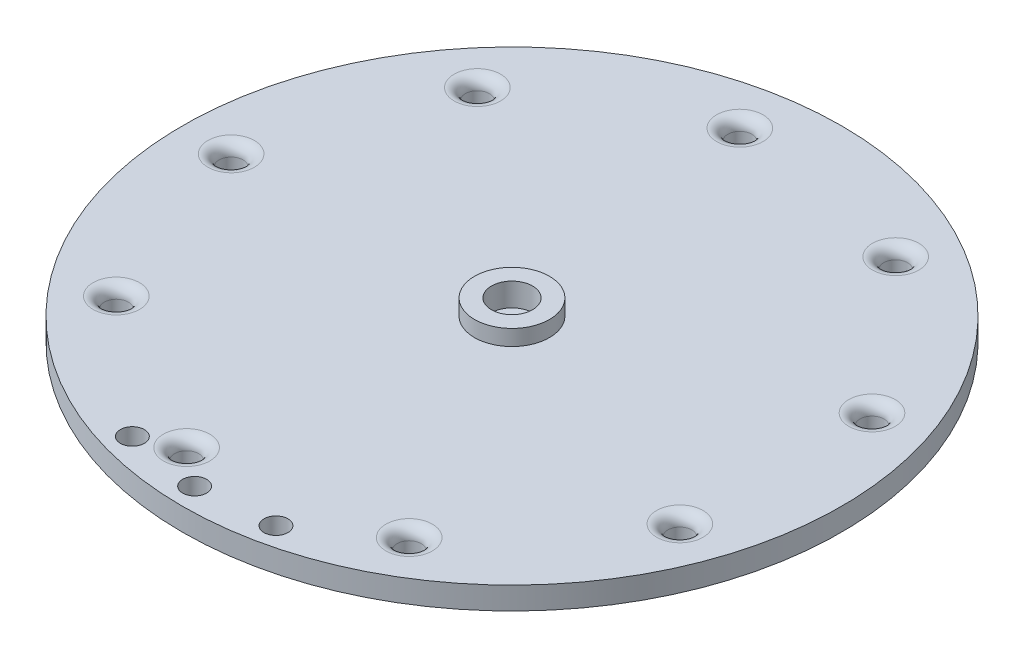
ISO-10303-21;
HEADER;
FILE_DESCRIPTION(('STEP AP214'),'2;1');
FILE_NAME('part.step','',(''),(''),'','','');
FILE_SCHEMA(('AUTOMOTIVE_DESIGN { 1 0 10303 214 1 1 1 1 }'));
ENDSEC;
DATA;
#1=APPLICATION_CONTEXT('core data for automotive mechanical design processes');
#2=APPLICATION_PROTOCOL_DEFINITION('international standard','automotive_design',2000,#1);
#3=PRODUCT_CONTEXT('',#1,'mechanical');
#4=PRODUCT('Part','Part','',(#3));
#5=PRODUCT_RELATED_PRODUCT_CATEGORY('part','',(#4));
#6=PRODUCT_DEFINITION_FORMATION('','',#4);
#7=PRODUCT_DEFINITION_CONTEXT('part definition',#1,'design');
#8=PRODUCT_DEFINITION('design','',#6,#7);
#9=PRODUCT_DEFINITION_SHAPE('','',#8);
#10=(LENGTH_UNIT() NAMED_UNIT(*) SI_UNIT(.MILLI.,.METRE.));
#11=(NAMED_UNIT(*) PLANE_ANGLE_UNIT() SI_UNIT($,.RADIAN.));
#12=(NAMED_UNIT(*) SI_UNIT($,.STERADIAN.) SOLID_ANGLE_UNIT());
#13=UNCERTAINTY_MEASURE_WITH_UNIT(LENGTH_MEASURE(1.E-05),#10,'distance_accuracy_value','');
#14=(GEOMETRIC_REPRESENTATION_CONTEXT(3) GLOBAL_UNCERTAINTY_ASSIGNED_CONTEXT((#13)) GLOBAL_UNIT_ASSIGNED_CONTEXT((#10,
#11,#12)) REPRESENTATION_CONTEXT('',''));
#15=CARTESIAN_POINT('',(0.,0.,0.));
#16=DIRECTION('',(0.,0.,1.));
#17=DIRECTION('',(1.,0.,0.));
#18=AXIS2_PLACEMENT_3D('',#15,#16,#17);
#19=CARTESIAN_POINT('',(0.,-1.5,0.));
#20=DIRECTION('',(0.,1.,0.));
#21=DIRECTION('',(0.,0.,1.));
#22=AXIS2_PLACEMENT_3D('',#19,#20,#21);
#23=CYLINDRICAL_SURFACE('',#22,1.6);
#24=CARTESIAN_POINT('',(0.,-1.5,0.));
#25=DIRECTION('',(0.,1.,0.));
#26=DIRECTION('',(0.,0.,1.));
#27=AXIS2_PLACEMENT_3D('',#24,#25,#26);
#28=CIRCLE('',#27,1.6);
#29=CARTESIAN_POINT('',(0.,-1.5,1.6));
#30=VERTEX_POINT('',#29);
#31=EDGE_CURVE('E74',#30,#30,#28,.T.);
#32=CARTESIAN_POINT('',(0.,0.5,0.));
#33=DIRECTION('',(0.,1.,0.));
#34=DIRECTION('',(0.,0.,1.));
#35=AXIS2_PLACEMENT_3D('',#32,#33,#34);
#36=CIRCLE('',#35,1.6);
#37=CARTESIAN_POINT('',(0.,0.5,1.6));
#38=VERTEX_POINT('',#37);
#39=EDGE_CURVE('E41',#38,#38,#36,.F.);
#40=CARTESIAN_POINT('',(0.,-1.5,1.6));
#41=CARTESIAN_POINT('',(0.,-1.47916666666667,1.6));
#42=CARTESIAN_POINT('',(0.,-1.45833333333333,1.6));
#43=CARTESIAN_POINT('',(0.,-1.41666666666667,1.6));
#44=CARTESIAN_POINT('',(0.,-1.39583333333333,1.6));
#45=CARTESIAN_POINT('',(0.,-1.35416666666667,1.6));
#46=CARTESIAN_POINT('',(0.,-1.33333333333333,1.6));
#47=CARTESIAN_POINT('',(0.,-1.29166666666667,1.6));
#48=CARTESIAN_POINT('',(0.,-1.27083333333333,1.6));
#49=CARTESIAN_POINT('',(0.,-1.22916666666667,1.6));
#50=CARTESIAN_POINT('',(0.,-1.20833333333333,1.6));
#51=CARTESIAN_POINT('',(0.,-1.16666666666667,1.6));
#52=CARTESIAN_POINT('',(0.,-1.14583333333333,1.6));
#53=CARTESIAN_POINT('',(0.,-1.10416666666667,1.6));
#54=CARTESIAN_POINT('',(0.,-1.08333333333333,1.6));
#55=CARTESIAN_POINT('',(0.,-1.04166666666667,1.6));
#56=CARTESIAN_POINT('',(0.,-1.02083333333333,1.6));
#57=CARTESIAN_POINT('',(0.,-0.979166666666666,1.6));
#58=CARTESIAN_POINT('',(0.,-0.958333333333333,1.6));
#59=CARTESIAN_POINT('',(0.,-0.916666666666666,1.6));
#60=CARTESIAN_POINT('',(0.,-0.895833333333333,1.6));
#61=CARTESIAN_POINT('',(0.,-0.854166666666667,1.6));
#62=CARTESIAN_POINT('',(0.,-0.833333333333333,1.6));
#63=CARTESIAN_POINT('',(0.,-0.791666666666667,1.6));
#64=CARTESIAN_POINT('',(0.,-0.770833333333333,1.6));
#65=CARTESIAN_POINT('',(0.,-0.729166666666667,1.6));
#66=CARTESIAN_POINT('',(0.,-0.708333333333333,1.6));
#67=CARTESIAN_POINT('',(0.,-0.666666666666666,1.6));
#68=CARTESIAN_POINT('',(0.,-0.645833333333333,1.6));
#69=CARTESIAN_POINT('',(0.,-0.604166666666667,1.6));
#70=CARTESIAN_POINT('',(0.,-0.583333333333333,1.6));
#71=CARTESIAN_POINT('',(0.,-0.541666666666667,1.6));
#72=CARTESIAN_POINT('',(0.,-0.520833333333333,1.6));
#73=CARTESIAN_POINT('',(0.,-0.479166666666667,1.6));
#74=CARTESIAN_POINT('',(0.,-0.458333333333333,1.6));
#75=CARTESIAN_POINT('',(0.,-0.416666666666667,1.6));
#76=CARTESIAN_POINT('',(0.,-0.395833333333333,1.6));
#77=CARTESIAN_POINT('',(0.,-0.354166666666667,1.6));
#78=CARTESIAN_POINT('',(0.,-0.333333333333333,1.6));
#79=CARTESIAN_POINT('',(0.,-0.291666666666667,1.6));
#80=CARTESIAN_POINT('',(0.,-0.270833333333333,1.6));
#81=CARTESIAN_POINT('',(0.,-0.229166666666667,1.6));
#82=CARTESIAN_POINT('',(0.,-0.208333333333333,1.6));
#83=CARTESIAN_POINT('',(0.,-0.166666666666667,1.6));
#84=CARTESIAN_POINT('',(0.,-0.145833333333333,1.6));
#85=CARTESIAN_POINT('',(0.,-0.104166666666667,1.6));
#86=CARTESIAN_POINT('',(0.,-0.0833333333333334,1.6));
#87=CARTESIAN_POINT('',(0.,-0.0416666666666667,1.6));
#88=CARTESIAN_POINT('',(0.,-0.0208333333333334,1.6));
#89=CARTESIAN_POINT('',(0.,0.0208333333333334,1.6));
#90=CARTESIAN_POINT('',(0.,0.0416666666666667,1.6));
#91=CARTESIAN_POINT('',(0.,0.0833333333333334,1.6));
#92=CARTESIAN_POINT('',(0.,0.104166666666667,1.6));
#93=CARTESIAN_POINT('',(0.,0.145833333333333,1.6));
#94=CARTESIAN_POINT('',(0.,0.166666666666667,1.6));
#95=CARTESIAN_POINT('',(0.,0.208333333333333,1.6));
#96=CARTESIAN_POINT('',(0.,0.229166666666667,1.6));
#97=CARTESIAN_POINT('',(0.,0.270833333333333,1.6));
#98=CARTESIAN_POINT('',(0.,0.291666666666667,1.6));
#99=CARTESIAN_POINT('',(0.,0.333333333333333,1.6));
#100=CARTESIAN_POINT('',(0.,0.354166666666667,1.6));
#101=CARTESIAN_POINT('',(0.,0.395833333333333,1.6));
#102=CARTESIAN_POINT('',(0.,0.416666666666667,1.6));
#103=CARTESIAN_POINT('',(0.,0.458333333333333,1.6));
#104=CARTESIAN_POINT('',(0.,0.479166666666667,1.6));
#105=CARTESIAN_POINT('',(0.,0.5,1.6));
#106=B_SPLINE_CURVE_WITH_KNOTS('',3,(#40,#41,#42,#43,#44,#45,#46,#47,#48,#49,#50,#51,#52,#53,
#54,#55,#56,#57,#58,#59,#60,#61,#62,#63,#64,#65,#66,#67,#68,#69,#70,#71,#72,#73,#74,#75,#76,#77,
#78,#79,#80,#81,#82,#83,#84,#85,#86,#87,#88,#89,#90,#91,#92,#93,#94,#95,#96,#97,#98,#99,#100,
#101,#102,#103,#104,#105),.UNSPECIFIED.,.F.,.F.,(4,2,2,2,2,2,2,2,2,2,2,2,2,2,2,2,2,2,2,2,2,2,2,
2,2,2,2,2,2,2,2,2,4),(0.,0.0625000000000001,0.125,0.1875,0.25,0.3125,0.375,0.4375,0.5,0.5625,
0.625,0.6875,0.75,0.8125,0.875,0.9375,1.,1.0625,1.125,1.1875,1.25,1.3125,1.375,1.4375,1.5,
1.5625,1.625,1.6875,1.75,1.8125,1.875,1.9375,2.),.UNSPECIFIED.);
#107=EDGE_CURVE('BSEAM37',#30,#38,#106,.T.);
#108=ORIENTED_EDGE('',*,*,#31,.F.);
#109=ORIENTED_EDGE('',*,*,#39,.F.);
#110=ORIENTED_EDGE('',*,*,#107,.T.);
#111=ORIENTED_EDGE('',*,*,#107,.F.);
#112=EDGE_LOOP('',(#108,#110,#109,#111));
#113=FACE_BOUND('',#112,.T.);
#114=ADVANCED_FACE('F37',(#113),#23,.F.);
#115=CARTESIAN_POINT('',(0.,1.5,0.));
#116=DIRECTION('',(0.,1.,0.));
#117=DIRECTION('',(0.,0.,1.));
#118=AXIS2_PLACEMENT_3D('',#115,#116,#117);
#119=PLANE('',#118);
#120=CARTESIAN_POINT('',(35.2384732794716,1.5,-12.8257553747126));
#121=DIRECTION('',(0.,1.,0.));
#122=DIRECTION('',(0.,0.,1.));
#123=AXIS2_PLACEMENT_3D('',#120,#121,#122);
#124=CIRCLE('',#123,3.1);
#125=CARTESIAN_POINT('',(35.2384732794716,1.5,-9.72575537471259));
#126=VERTEX_POINT('',#125);
#127=EDGE_CURVE('E185',#126,#126,#124,.F.);
#128=ORIENTED_EDGE('',*,*,#127,.T.);
#129=EDGE_LOOP('',(#128));
#130=FACE_BOUND('',#129,.T.);
#131=CARTESIAN_POINT('',(-6.51180666250987,1.5,36.9302907379578));
#132=DIRECTION('',(0.,1.,0.));
#133=DIRECTION('',(0.,0.,1.));
#134=AXIS2_PLACEMENT_3D('',#131,#132,#133);
#135=CIRCLE('',#134,3.1);
#136=CARTESIAN_POINT('',(-6.51180666250987,1.5,40.0302907379578));
#137=VERTEX_POINT('',#136);
#138=EDGE_CURVE('E181',#137,#137,#135,.F.);
#139=ORIENTED_EDGE('',*,*,#138,.T.);
#140=EDGE_LOOP('',(#139));
#141=FACE_BOUND('',#140,.T.);
#142=CARTESIAN_POINT('',(18.75,1.5,32.4759526419164));
#143=DIRECTION('',(0.,1.,0.));
#144=DIRECTION('',(0.,0.,1.));
#145=AXIS2_PLACEMENT_3D('',#142,#143,#144);
#146=CIRCLE('',#145,3.1);
#147=CARTESIAN_POINT('',(18.75,1.5,35.5759526419164));
#148=VERTEX_POINT('',#147);
#149=EDGE_CURVE('E177',#148,#148,#146,.F.);
#150=ORIENTED_EDGE('',*,*,#149,.T.);
#151=EDGE_LOOP('',(#150));
#152=FACE_BOUND('',#151,.T.);
#153=CARTESIAN_POINT('',(35.2384732794716,1.5,12.8257553747126));
#154=DIRECTION('',(0.,1.,0.));
#155=DIRECTION('',(0.,0.,1.));
#156=AXIS2_PLACEMENT_3D('',#153,#154,#155);
#157=CIRCLE('',#156,3.1);
#158=CARTESIAN_POINT('',(35.2384732794716,1.5,15.9257553747126));
#159=VERTEX_POINT('',#158);
#160=EDGE_CURVE('E173',#159,#159,#157,.F.);
#161=ORIENTED_EDGE('',*,*,#160,.T.);
#162=EDGE_LOOP('',(#161));
#163=FACE_BOUND('',#162,.T.);
#164=CARTESIAN_POINT('',(18.75,1.5,-32.4759526419165));
#165=DIRECTION('',(0.,1.,0.));
#166=DIRECTION('',(0.,0.,1.));
#167=AXIS2_PLACEMENT_3D('',#164,#165,#166);
#168=CIRCLE('',#167,3.1);
#169=CARTESIAN_POINT('',(18.75,1.5,-29.3759526419165));
#170=VERTEX_POINT('',#169);
#171=EDGE_CURVE('E169',#170,#170,#168,.F.);
#172=ORIENTED_EDGE('',*,*,#171,.T.);
#173=EDGE_LOOP('',(#172));
#174=FACE_BOUND('',#173,.T.);
#175=CARTESIAN_POINT('',(-6.51180666250989,1.5,-36.9302907379578));
#176=DIRECTION('',(0.,1.,0.));
#177=DIRECTION('',(0.,0.,1.));
#178=AXIS2_PLACEMENT_3D('',#175,#176,#177);
#179=CIRCLE('',#178,3.1);
#180=CARTESIAN_POINT('',(-6.51180666250989,1.5,-33.8302907379578));
#181=VERTEX_POINT('',#180);
#182=EDGE_CURVE('E165',#181,#181,#179,.F.);
#183=ORIENTED_EDGE('',*,*,#182,.T.);
#184=EDGE_LOOP('',(#183));
#185=FACE_BOUND('',#184,.T.);
#186=CARTESIAN_POINT('',(-28.7266666169617,1.5,-24.1045353632452));
#187=DIRECTION('',(0.,1.,0.));
#188=DIRECTION('',(0.,0.,1.));
#189=AXIS2_PLACEMENT_3D('',#186,#187,#188);
#190=CIRCLE('',#189,3.1);
#191=CARTESIAN_POINT('',(-28.7266666169617,1.5,-21.0045353632452));
#192=VERTEX_POINT('',#191);
#193=EDGE_CURVE('E161',#192,#192,#190,.F.);
#194=ORIENTED_EDGE('',*,*,#193,.T.);
#195=EDGE_LOOP('',(#194));
#196=FACE_BOUND('',#195,.T.);
#197=CARTESIAN_POINT('',(-37.5,1.5,0.));
#198=DIRECTION('',(0.,1.,0.));
#199=DIRECTION('',(0.,0.,1.));
#200=AXIS2_PLACEMENT_3D('',#197,#198,#199);
#201=CIRCLE('',#200,3.1);
#202=CARTESIAN_POINT('',(-37.5,1.5,3.1));
#203=VERTEX_POINT('',#202);
#204=EDGE_CURVE('E157',#203,#203,#201,.F.);
#205=ORIENTED_EDGE('',*,*,#204,.T.);
#206=EDGE_LOOP('',(#205));
#207=FACE_BOUND('',#206,.T.);
#208=CARTESIAN_POINT('',(-28.7266666169617,1.5,24.1045353632452));
#209=DIRECTION('',(0.,1.,0.));
#210=DIRECTION('',(0.,0.,1.));
#211=AXIS2_PLACEMENT_3D('',#208,#209,#210);
#212=CIRCLE('',#211,3.1);
#213=CARTESIAN_POINT('',(-28.7266666169617,1.5,27.2045353632452));
#214=VERTEX_POINT('',#213);
#215=EDGE_CURVE('E153',#214,#214,#212,.F.);
#216=ORIENTED_EDGE('',*,*,#215,.T.);
#217=EDGE_LOOP('',(#216));
#218=FACE_BOUND('',#217,.T.);
#219=CARTESIAN_POINT('',(0.,1.5,0.));
#220=DIRECTION('',(0.,1.,0.));
#221=DIRECTION('',(0.,0.,1.));
#222=AXIS2_PLACEMENT_3D('',#219,#220,#221);
#223=CIRCLE('',#222,5.);
#224=CARTESIAN_POINT('',(0.,1.5,5.));
#225=VERTEX_POINT('',#224);
#226=EDGE_CURVE('E64',#225,#225,#223,.T.);
#227=ORIENTED_EDGE('',*,*,#226,.F.);
#228=EDGE_LOOP('',(#227));
#229=FACE_BOUND('',#228,.T.);
#230=CARTESIAN_POINT('',(8.48819333749013,1.5,40.));
#231=DIRECTION('',(0.,1.,0.));
#232=DIRECTION('',(0.,0.,1.));
#233=AXIS2_PLACEMENT_3D('',#230,#231,#232);
#234=CIRCLE('',#233,1.6);
#235=CARTESIAN_POINT('',(8.48819333749013,1.5,41.6));
#236=VERTEX_POINT('',#235);
#237=EDGE_CURVE('E101',#236,#236,#234,.T.);
#238=ORIENTED_EDGE('',*,*,#237,.F.);
#239=EDGE_LOOP('',(#238));
#240=FACE_BOUND('',#239,.T.);
#241=CARTESIAN_POINT('',(-1.51180666250987,1.5,40.8627442390964));
#242=DIRECTION('',(0.,1.,0.));
#243=DIRECTION('',(0.,0.,1.));
#244=AXIS2_PLACEMENT_3D('',#241,#242,#243);
#245=CIRCLE('',#244,1.6);
#246=CARTESIAN_POINT('',(-1.51180666250987,1.5,42.4627442390964));
#247=VERTEX_POINT('',#246);
#248=EDGE_CURVE('E97',#247,#247,#245,.T.);
#249=ORIENTED_EDGE('',*,*,#248,.F.);
#250=EDGE_LOOP('',(#249));
#251=FACE_BOUND('',#250,.T.);
#252=CARTESIAN_POINT('',(-11.4207172824182,1.5,39.2634262754753));
#253=DIRECTION('',(0.,1.,0.));
#254=DIRECTION('',(0.,0.,1.));
#255=AXIS2_PLACEMENT_3D('',#252,#253,#254);
#256=CIRCLE('',#255,1.6);
#257=CARTESIAN_POINT('',(-11.4207172824182,1.5,40.8634262754753));
#258=VERTEX_POINT('',#257);
#259=EDGE_CURVE('E86',#258,#258,#256,.T.);
#260=ORIENTED_EDGE('',*,*,#259,.F.);
#261=EDGE_LOOP('',(#260));
#262=FACE_BOUND('',#261,.T.);
#263=CARTESIAN_POINT('',(0.,1.5,0.));
#264=DIRECTION('',(0.,1.,0.));
#265=DIRECTION('',(0.,0.,1.));
#266=AXIS2_PLACEMENT_3D('',#263,#264,#265);
#267=CIRCLE('',#266,44.);
#268=CARTESIAN_POINT('',(0.,1.5,44.));
#269=VERTEX_POINT('',#268);
#270=EDGE_CURVE('E142',#269,#269,#267,.T.);
#271=ORIENTED_EDGE('',*,*,#270,.T.);
#272=EDGE_LOOP('',(#271));
#273=FACE_BOUND('',#272,.T.);
#274=ADVANCED_FACE('F231',(#130,#141,#152,#163,#174,#185,#196,#207,#218,#229,#240,#251,#262,
#273),#119,.T.);
#275=CARTESIAN_POINT('',(0.,-1.5,0.));
#276=DIRECTION('',(0.,1.,0.));
#277=DIRECTION('',(0.,0.,1.));
#278=AXIS2_PLACEMENT_3D('',#275,#276,#277);
#279=PLANE('',#278);
#280=ORIENTED_EDGE('',*,*,#31,.T.);
#281=EDGE_LOOP('',(#280));
#282=FACE_BOUND('',#281,.T.);
#283=CARTESIAN_POINT('',(8.48819333749013,-1.5,40.));
#284=DIRECTION('',(0.,-1.,0.));
#285=DIRECTION('',(0.,0.,-1.));
#286=AXIS2_PLACEMENT_3D('',#283,#284,#285);
#287=CIRCLE('',#286,1.6);
#288=CARTESIAN_POINT('',(8.48819333749013,-1.5,38.4));
#289=VERTEX_POINT('',#288);
#290=EDGE_CURVE('E82',#289,#289,#287,.T.);
#291=ORIENTED_EDGE('',*,*,#290,.F.);
#292=EDGE_LOOP('',(#291));
#293=FACE_BOUND('',#292,.T.);
#294=CARTESIAN_POINT('',(-1.51180666250987,-1.5,40.8627442390964));
#295=DIRECTION('',(0.,-1.,0.));
#296=DIRECTION('',(0.,0.,-1.));
#297=AXIS2_PLACEMENT_3D('',#294,#295,#296);
#298=CIRCLE('',#297,1.6);
#299=CARTESIAN_POINT('',(-1.51180666250987,-1.5,39.2627442390964));
#300=VERTEX_POINT('',#299);
#301=EDGE_CURVE('E87',#300,#300,#298,.T.);
#302=ORIENTED_EDGE('',*,*,#301,.F.);
#303=EDGE_LOOP('',(#302));
#304=FACE_BOUND('',#303,.T.);
#305=CARTESIAN_POINT('',(-11.4207172824182,-1.5,39.2634262754753));
#306=DIRECTION('',(0.,-1.,0.));
#307=DIRECTION('',(0.,0.,-1.));
#308=AXIS2_PLACEMENT_3D('',#305,#306,#307);
#309=CIRCLE('',#308,1.6);
#310=CARTESIAN_POINT('',(-11.4207172824182,-1.5,37.6634262754753));
#311=VERTEX_POINT('',#310);
#312=EDGE_CURVE('E81',#311,#311,#309,.T.);
#313=ORIENTED_EDGE('',*,*,#312,.F.);
#314=EDGE_LOOP('',(#313));
#315=FACE_BOUND('',#314,.T.);
#316=CARTESIAN_POINT('',(0.,-1.5,0.));
#317=DIRECTION('',(0.,1.,0.));
#318=DIRECTION('',(0.,0.,1.));
#319=AXIS2_PLACEMENT_3D('',#316,#317,#318);
#320=CIRCLE('',#319,44.);
#321=CARTESIAN_POINT('',(0.,-1.5,44.));
#322=VERTEX_POINT('',#321);
#323=EDGE_CURVE('E141',#322,#322,#320,.T.);
#324=ORIENTED_EDGE('',*,*,#323,.F.);
#325=EDGE_LOOP('',(#324));
#326=FACE_BOUND('',#325,.T.);
#327=CARTESIAN_POINT('',(-37.5,-1.5,0.));
#328=DIRECTION('',(0.,1.,0.));
#329=DIRECTION('',(0.,0.,1.));
#330=AXIS2_PLACEMENT_3D('',#327,#328,#329);
#331=CIRCLE('',#330,1.6);
#332=CARTESIAN_POINT('',(-37.5,-1.5,1.6));
#333=VERTEX_POINT('',#332);
#334=EDGE_CURVE('E137',#333,#333,#331,.T.);
#335=ORIENTED_EDGE('',*,*,#334,.T.);
#336=EDGE_LOOP('',(#335));
#337=FACE_BOUND('',#336,.T.);
#338=CARTESIAN_POINT('',(-28.7266666169617,-1.5,-24.1045353632452));
#339=DIRECTION('',(0.,1.,0.));
#340=DIRECTION('',(0.,0.,1.));
#341=AXIS2_PLACEMENT_3D('',#338,#339,#340);
#342=CIRCLE('',#341,1.6);
#343=CARTESIAN_POINT('',(-28.7266666169617,-1.5,-22.5045353632452));
#344=VERTEX_POINT('',#343);
#345=EDGE_CURVE('E133',#344,#344,#342,.T.);
#346=ORIENTED_EDGE('',*,*,#345,.T.);
#347=EDGE_LOOP('',(#346));
#348=FACE_BOUND('',#347,.T.);
#349=CARTESIAN_POINT('',(-6.51180666250989,-1.5,-36.9302907379578));
#350=DIRECTION('',(0.,1.,0.));
#351=DIRECTION('',(0.,0.,1.));
#352=AXIS2_PLACEMENT_3D('',#349,#350,#351);
#353=CIRCLE('',#352,1.6);
#354=CARTESIAN_POINT('',(-6.51180666250989,-1.5,-35.3302907379578));
#355=VERTEX_POINT('',#354);
#356=EDGE_CURVE('E129',#355,#355,#353,.T.);
#357=ORIENTED_EDGE('',*,*,#356,.T.);
#358=EDGE_LOOP('',(#357));
#359=FACE_BOUND('',#358,.T.);
#360=CARTESIAN_POINT('',(18.75,-1.5,-32.4759526419165));
#361=DIRECTION('',(0.,1.,0.));
#362=DIRECTION('',(0.,0.,1.));
#363=AXIS2_PLACEMENT_3D('',#360,#361,#362);
#364=CIRCLE('',#363,1.6);
#365=CARTESIAN_POINT('',(18.75,-1.5,-30.8759526419165));
#366=VERTEX_POINT('',#365);
#367=EDGE_CURVE('E125',#366,#366,#364,.T.);
#368=ORIENTED_EDGE('',*,*,#367,.T.);
#369=EDGE_LOOP('',(#368));
#370=FACE_BOUND('',#369,.T.);
#371=CARTESIAN_POINT('',(35.2384732794716,-1.5,-12.8257553747126));
#372=DIRECTION('',(0.,1.,0.));
#373=DIRECTION('',(0.,0.,1.));
#374=AXIS2_PLACEMENT_3D('',#371,#372,#373);
#375=CIRCLE('',#374,1.6);
#376=CARTESIAN_POINT('',(35.2384732794716,-1.5,-11.2257553747126));
#377=VERTEX_POINT('',#376);
#378=EDGE_CURVE('E121',#377,#377,#375,.T.);
#379=ORIENTED_EDGE('',*,*,#378,.T.);
#380=EDGE_LOOP('',(#379));
#381=FACE_BOUND('',#380,.T.);
#382=CARTESIAN_POINT('',(35.2384732794716,-1.5,12.8257553747126));
#383=DIRECTION('',(0.,1.,0.));
#384=DIRECTION('',(0.,0.,1.));
#385=AXIS2_PLACEMENT_3D('',#382,#383,#384);
#386=CIRCLE('',#385,1.6);
#387=CARTESIAN_POINT('',(35.2384732794716,-1.5,14.4257553747126));
#388=VERTEX_POINT('',#387);
#389=EDGE_CURVE('E117',#388,#388,#386,.T.);
#390=ORIENTED_EDGE('',*,*,#389,.T.);
#391=EDGE_LOOP('',(#390));
#392=FACE_BOUND('',#391,.T.);
#393=CARTESIAN_POINT('',(18.75,-1.5,32.4759526419164));
#394=DIRECTION('',(0.,1.,0.));
#395=DIRECTION('',(0.,0.,1.));
#396=AXIS2_PLACEMENT_3D('',#393,#394,#395);
#397=CIRCLE('',#396,1.6);
#398=CARTESIAN_POINT('',(18.75,-1.5,34.0759526419164));
#399=VERTEX_POINT('',#398);
#400=EDGE_CURVE('E113',#399,#399,#397,.T.);
#401=ORIENTED_EDGE('',*,*,#400,.T.);
#402=EDGE_LOOP('',(#401));
#403=FACE_BOUND('',#402,.T.);
#404=CARTESIAN_POINT('',(-6.51180666250987,-1.5,36.9302907379578));
#405=DIRECTION('',(0.,1.,0.));
#406=DIRECTION('',(0.,0.,1.));
#407=AXIS2_PLACEMENT_3D('',#404,#405,#406);
#408=CIRCLE('',#407,1.6);
#409=CARTESIAN_POINT('',(-6.51180666250987,-1.5,38.5302907379578));
#410=VERTEX_POINT('',#409);
#411=EDGE_CURVE('E109',#410,#410,#408,.T.);
#412=ORIENTED_EDGE('',*,*,#411,.T.);
#413=EDGE_LOOP('',(#412));
#414=FACE_BOUND('',#413,.T.);
#415=CARTESIAN_POINT('',(-28.7266666169617,-1.5,24.1045353632452));
#416=DIRECTION('',(0.,1.,0.));
#417=DIRECTION('',(0.,0.,1.));
#418=AXIS2_PLACEMENT_3D('',#415,#416,#417);
#419=CIRCLE('',#418,1.6);
#420=CARTESIAN_POINT('',(-28.7266666169617,-1.5,25.7045353632452));
#421=VERTEX_POINT('',#420);
#422=EDGE_CURVE('E105',#421,#421,#419,.T.);
#423=ORIENTED_EDGE('',*,*,#422,.T.);
#424=EDGE_LOOP('',(#423));
#425=FACE_BOUND('',#424,.T.);
#426=ADVANCED_FACE('F237',(#282,#293,#304,#315,#326,#337,#348,#359,#370,#381,#392,#403,#414,
#425),#279,.F.);
#427=CARTESIAN_POINT('',(0.,1.5,0.));
#428=DIRECTION('',(0.,-1.,0.));
#429=DIRECTION('',(0.,0.,-1.));
#430=AXIS2_PLACEMENT_3D('',#427,#428,#429);
#431=CYLINDRICAL_SURFACE('',#430,44.);
#432=ORIENTED_EDGE('',*,*,#270,.F.);
#433=EDGE_LOOP('',(#432));
#434=FACE_BOUND('',#433,.T.);
#435=ORIENTED_EDGE('',*,*,#323,.T.);
#436=EDGE_LOOP('',(#435));
#437=FACE_BOUND('',#436,.T.);
#438=ADVANCED_FACE('F290',(#434,#437),#431,.T.);
#439=CARTESIAN_POINT('',(-37.5,1.5,0.));
#440=DIRECTION('',(0.,-1.,0.));
#441=DIRECTION('',(0.,0.,-1.));
#442=AXIS2_PLACEMENT_3D('',#439,#440,#441);
#443=CYLINDRICAL_SURFACE('',#442,1.6);
#444=CARTESIAN_POINT('',(-37.5,0.,0.));
#445=DIRECTION('',(0.,1.,0.));
#446=DIRECTION('',(0.,0.,1.));
#447=AXIS2_PLACEMENT_3D('',#444,#445,#446);
#448=CIRCLE('',#447,1.6);
#449=CARTESIAN_POINT('',(-37.5,0.,1.6));
#450=VERTEX_POINT('',#449);
#451=EDGE_CURVE('E46',#450,#450,#448,.T.);
#452=ORIENTED_EDGE('',*,*,#451,.T.);
#453=EDGE_LOOP('',(#452));
#454=FACE_BOUND('',#453,.T.);
#455=ORIENTED_EDGE('',*,*,#334,.F.);
#456=EDGE_LOOP('',(#455));
#457=FACE_BOUND('',#456,.T.);
#458=ADVANCED_FACE('F288',(#454,#457),#443,.F.);
#459=CARTESIAN_POINT('',(-28.7266666169617,1.5,-24.1045353632452));
#460=DIRECTION('',(0.,-1.,0.));
#461=DIRECTION('',(0.,0.,-1.));
#462=AXIS2_PLACEMENT_3D('',#459,#460,#461);
#463=CYLINDRICAL_SURFACE('',#462,1.6);
#464=CARTESIAN_POINT('',(-28.7266666169617,0.,-24.1045353632452));
#465=DIRECTION('',(0.,1.,0.));
#466=DIRECTION('',(0.,0.,1.));
#467=AXIS2_PLACEMENT_3D('',#464,#465,#466);
#468=CIRCLE('',#467,1.6);
#469=CARTESIAN_POINT('',(-28.7266666169617,0.,-22.5045353632452));
#470=VERTEX_POINT('',#469);
#471=EDGE_CURVE('E52',#470,#470,#468,.T.);
#472=ORIENTED_EDGE('',*,*,#471,.T.);
#473=EDGE_LOOP('',(#472));
#474=FACE_BOUND('',#473,.T.);
#475=ORIENTED_EDGE('',*,*,#345,.F.);
#476=EDGE_LOOP('',(#475));
#477=FACE_BOUND('',#476,.T.);
#478=ADVANCED_FACE('F212',(#474,#477),#463,.F.);
#479=CARTESIAN_POINT('',(-6.51180666250989,1.5,-36.9302907379578));
#480=DIRECTION('',(0.,-1.,0.));
#481=DIRECTION('',(0.,0.,-1.));
#482=AXIS2_PLACEMENT_3D('',#479,#480,#481);
#483=CYLINDRICAL_SURFACE('',#482,1.6);
#484=CARTESIAN_POINT('',(-6.51180666250989,0.,-36.9302907379578));
#485=DIRECTION('',(0.,1.,0.));
#486=DIRECTION('',(0.,0.,1.));
#487=AXIS2_PLACEMENT_3D('',#484,#485,#486);
#488=CIRCLE('',#487,1.6);
#489=CARTESIAN_POINT('',(-6.51180666250989,0.,-35.3302907379578));
#490=VERTEX_POINT('',#489);
#491=EDGE_CURVE('E205',#490,#490,#488,.T.);
#492=ORIENTED_EDGE('',*,*,#491,.T.);
#493=EDGE_LOOP('',(#492));
#494=FACE_BOUND('',#493,.T.);
#495=ORIENTED_EDGE('',*,*,#356,.F.);
#496=EDGE_LOOP('',(#495));
#497=FACE_BOUND('',#496,.T.);
#498=ADVANCED_FACE('F281',(#494,#497),#483,.F.);
#499=CARTESIAN_POINT('',(18.75,1.5,-32.4759526419165));
#500=DIRECTION('',(0.,-1.,0.));
#501=DIRECTION('',(0.,0.,-1.));
#502=AXIS2_PLACEMENT_3D('',#499,#500,#501);
#503=CYLINDRICAL_SURFACE('',#502,1.6);
#504=CARTESIAN_POINT('',(18.75,0.,-32.4759526419165));
#505=DIRECTION('',(0.,1.,0.));
#506=DIRECTION('',(0.,0.,1.));
#507=AXIS2_PLACEMENT_3D('',#504,#505,#506);
#508=CIRCLE('',#507,1.6);
#509=CARTESIAN_POINT('',(18.75,0.,-30.8759526419165));
#510=VERTEX_POINT('',#509);
#511=EDGE_CURVE('E201',#510,#510,#508,.T.);
#512=ORIENTED_EDGE('',*,*,#511,.T.);
#513=EDGE_LOOP('',(#512));
#514=FACE_BOUND('',#513,.T.);
#515=ORIENTED_EDGE('',*,*,#367,.F.);
#516=EDGE_LOOP('',(#515));
#517=FACE_BOUND('',#516,.T.);
#518=ADVANCED_FACE('F277',(#514,#517),#503,.F.);
#519=CARTESIAN_POINT('',(35.2384732794716,1.5,-12.8257553747126));
#520=DIRECTION('',(0.,-1.,0.));
#521=DIRECTION('',(0.,0.,-1.));
#522=AXIS2_PLACEMENT_3D('',#519,#520,#521);
#523=CYLINDRICAL_SURFACE('',#522,1.6);
#524=CARTESIAN_POINT('',(35.2384732794716,0.,-12.8257553747126));
#525=DIRECTION('',(0.,1.,0.));
#526=DIRECTION('',(0.,0.,1.));
#527=AXIS2_PLACEMENT_3D('',#524,#525,#526);
#528=CIRCLE('',#527,1.6);
#529=CARTESIAN_POINT('',(35.2384732794716,0.,-11.2257553747126));
#530=VERTEX_POINT('',#529);
#531=EDGE_CURVE('E146',#530,#530,#528,.T.);
#532=ORIENTED_EDGE('',*,*,#531,.T.);
#533=EDGE_LOOP('',(#532));
#534=FACE_BOUND('',#533,.T.);
#535=ORIENTED_EDGE('',*,*,#378,.F.);
#536=EDGE_LOOP('',(#535));
#537=FACE_BOUND('',#536,.T.);
#538=ADVANCED_FACE('F273',(#534,#537),#523,.F.);
#539=CARTESIAN_POINT('',(35.2384732794716,1.5,12.8257553747126));
#540=DIRECTION('',(0.,-1.,0.));
#541=DIRECTION('',(0.,0.,-1.));
#542=AXIS2_PLACEMENT_3D('',#539,#540,#541);
#543=CYLINDRICAL_SURFACE('',#542,1.6);
#544=CARTESIAN_POINT('',(35.2384732794716,0.,12.8257553747126));
#545=DIRECTION('',(0.,1.,0.));
#546=DIRECTION('',(0.,0.,1.));
#547=AXIS2_PLACEMENT_3D('',#544,#545,#546);
#548=CIRCLE('',#547,1.6);
#549=CARTESIAN_POINT('',(35.2384732794716,0.,14.4257553747126));
#550=VERTEX_POINT('',#549);
#551=EDGE_CURVE('E197',#550,#550,#548,.T.);
#552=ORIENTED_EDGE('',*,*,#551,.T.);
#553=EDGE_LOOP('',(#552));
#554=FACE_BOUND('',#553,.T.);
#555=ORIENTED_EDGE('',*,*,#389,.F.);
#556=EDGE_LOOP('',(#555));
#557=FACE_BOUND('',#556,.T.);
#558=ADVANCED_FACE('F269',(#554,#557),#543,.F.);
#559=CARTESIAN_POINT('',(18.75,1.5,32.4759526419164));
#560=DIRECTION('',(0.,-1.,0.));
#561=DIRECTION('',(0.,0.,-1.));
#562=AXIS2_PLACEMENT_3D('',#559,#560,#561);
#563=CYLINDRICAL_SURFACE('',#562,1.6);
#564=CARTESIAN_POINT('',(18.75,0.,32.4759526419164));
#565=DIRECTION('',(0.,1.,0.));
#566=DIRECTION('',(0.,0.,1.));
#567=AXIS2_PLACEMENT_3D('',#564,#565,#566);
#568=CIRCLE('',#567,1.6);
#569=CARTESIAN_POINT('',(18.75,0.,34.0759526419164));
#570=VERTEX_POINT('',#569);
#571=EDGE_CURVE('E193',#570,#570,#568,.T.);
#572=ORIENTED_EDGE('',*,*,#571,.T.);
#573=EDGE_LOOP('',(#572));
#574=FACE_BOUND('',#573,.T.);
#575=ORIENTED_EDGE('',*,*,#400,.F.);
#576=EDGE_LOOP('',(#575));
#577=FACE_BOUND('',#576,.T.);
#578=ADVANCED_FACE('F265',(#574,#577),#563,.F.);
#579=CARTESIAN_POINT('',(-6.51180666250987,1.5,36.9302907379578));
#580=DIRECTION('',(0.,-1.,0.));
#581=DIRECTION('',(0.,0.,-1.));
#582=AXIS2_PLACEMENT_3D('',#579,#580,#581);
#583=CYLINDRICAL_SURFACE('',#582,1.6);
#584=CARTESIAN_POINT('',(-6.51180666250987,0.,36.9302907379578));
#585=DIRECTION('',(0.,1.,0.));
#586=DIRECTION('',(0.,0.,1.));
#587=AXIS2_PLACEMENT_3D('',#584,#585,#586);
#588=CIRCLE('',#587,1.6);
#589=CARTESIAN_POINT('',(-6.51180666250987,0.,38.5302907379578));
#590=VERTEX_POINT('',#589);
#591=EDGE_CURVE('E189',#590,#590,#588,.T.);
#592=ORIENTED_EDGE('',*,*,#591,.T.);
#593=EDGE_LOOP('',(#592));
#594=FACE_BOUND('',#593,.T.);
#595=ORIENTED_EDGE('',*,*,#411,.F.);
#596=EDGE_LOOP('',(#595));
#597=FACE_BOUND('',#596,.T.);
#598=ADVANCED_FACE('F262',(#594,#597),#583,.F.);
#599=CARTESIAN_POINT('',(-28.7266666169617,1.5,24.1045353632452));
#600=DIRECTION('',(0.,-1.,0.));
#601=DIRECTION('',(0.,0.,-1.));
#602=AXIS2_PLACEMENT_3D('',#599,#600,#601);
#603=CYLINDRICAL_SURFACE('',#602,1.6);
#604=CARTESIAN_POINT('',(-28.7266666169617,0.,24.1045353632452));
#605=DIRECTION('',(0.,1.,0.));
#606=DIRECTION('',(0.,0.,1.));
#607=AXIS2_PLACEMENT_3D('',#604,#605,#606);
#608=CIRCLE('',#607,1.6);
#609=CARTESIAN_POINT('',(-28.7266666169617,0.,25.7045353632452));
#610=VERTEX_POINT('',#609);
#611=EDGE_CURVE('E10',#610,#610,#608,.T.);
#612=ORIENTED_EDGE('',*,*,#611,.T.);
#613=EDGE_LOOP('',(#612));
#614=FACE_BOUND('',#613,.T.);
#615=ORIENTED_EDGE('',*,*,#422,.F.);
#616=EDGE_LOOP('',(#615));
#617=FACE_BOUND('',#616,.T.);
#618=ADVANCED_FACE('F258',(#614,#617),#603,.F.);
#619=CARTESIAN_POINT('',(-11.4207172824182,8.5,39.2634262754753));
#620=DIRECTION('',(0.,-1.,0.));
#621=DIRECTION('',(0.,0.,-1.));
#622=AXIS2_PLACEMENT_3D('',#619,#620,#621);
#623=CYLINDRICAL_SURFACE('',#622,1.6);
#624=ORIENTED_EDGE('',*,*,#259,.T.);
#625=EDGE_LOOP('',(#624));
#626=FACE_BOUND('',#625,.T.);
#627=ORIENTED_EDGE('',*,*,#312,.T.);
#628=EDGE_LOOP('',(#627));
#629=FACE_BOUND('',#628,.T.);
#630=ADVANCED_FACE('F254',(#626,#629),#623,.F.);
#631=CARTESIAN_POINT('',(-1.51180666250987,8.5,40.8627442390964));
#632=DIRECTION('',(0.,-1.,0.));
#633=DIRECTION('',(0.,0.,-1.));
#634=AXIS2_PLACEMENT_3D('',#631,#632,#633);
#635=CYLINDRICAL_SURFACE('',#634,1.6);
#636=ORIENTED_EDGE('',*,*,#248,.T.);
#637=EDGE_LOOP('',(#636));
#638=FACE_BOUND('',#637,.T.);
#639=ORIENTED_EDGE('',*,*,#301,.T.);
#640=EDGE_LOOP('',(#639));
#641=FACE_BOUND('',#640,.T.);
#642=ADVANCED_FACE('F250',(#638,#641),#635,.F.);
#643=CARTESIAN_POINT('',(8.48819333749013,8.5,40.));
#644=DIRECTION('',(0.,-1.,0.));
#645=DIRECTION('',(0.,0.,-1.));
#646=AXIS2_PLACEMENT_3D('',#643,#644,#645);
#647=CYLINDRICAL_SURFACE('',#646,1.6);
#648=ORIENTED_EDGE('',*,*,#237,.T.);
#649=EDGE_LOOP('',(#648));
#650=FACE_BOUND('',#649,.T.);
#651=ORIENTED_EDGE('',*,*,#290,.T.);
#652=EDGE_LOOP('',(#651));
#653=FACE_BOUND('',#652,.T.);
#654=ADVANCED_FACE('F246',(#650,#653),#647,.F.);
#655=CARTESIAN_POINT('',(0.,3.6,0.));
#656=DIRECTION('',(0.,1.,0.));
#657=DIRECTION('',(0.,0.,1.));
#658=AXIS2_PLACEMENT_3D('',#655,#656,#657);
#659=PLANE('',#658);
#660=CARTESIAN_POINT('',(0.,3.6,0.));
#661=DIRECTION('',(0.,1.,0.));
#662=DIRECTION('',(0.,0.,1.));
#663=AXIS2_PLACEMENT_3D('',#660,#661,#662);
#664=CIRCLE('',#663,2.75);
#665=CARTESIAN_POINT('',(0.,3.6,2.75));
#666=VERTEX_POINT('',#665);
#667=EDGE_CURVE('E55',#666,#666,#664,.T.);
#668=ORIENTED_EDGE('',*,*,#667,.F.);
#669=EDGE_LOOP('',(#668));
#670=FACE_BOUND('',#669,.T.);
#671=CARTESIAN_POINT('',(0.,3.6,0.));
#672=DIRECTION('',(0.,1.,0.));
#673=DIRECTION('',(0.,0.,1.));
#674=AXIS2_PLACEMENT_3D('',#671,#672,#673);
#675=CIRCLE('',#674,5.);
#676=CARTESIAN_POINT('',(0.,3.6,5.));
#677=VERTEX_POINT('',#676);
#678=EDGE_CURVE('E70',#677,#677,#675,.T.);
#679=ORIENTED_EDGE('',*,*,#678,.T.);
#680=EDGE_LOOP('',(#679));
#681=FACE_BOUND('',#680,.T.);
#682=ADVANCED_FACE('F249',(#670,#681),#659,.T.);
#683=CARTESIAN_POINT('',(0.,3.6,0.));
#684=DIRECTION('',(0.,-1.,0.));
#685=DIRECTION('',(0.,0.,-1.));
#686=AXIS2_PLACEMENT_3D('',#683,#684,#685);
#687=CYLINDRICAL_SURFACE('',#686,5.);
#688=ORIENTED_EDGE('',*,*,#678,.F.);
#689=EDGE_LOOP('',(#688));
#690=FACE_BOUND('',#689,.T.);
#691=ORIENTED_EDGE('',*,*,#226,.T.);
#692=EDGE_LOOP('',(#691));
#693=FACE_BOUND('',#692,.T.);
#694=ADVANCED_FACE('F244',(#690,#693),#687,.T.);
#695=CARTESIAN_POINT('',(35.2384732794716,0.,-12.8257553747126));
#696=DIRECTION('',(0.,1.,0.));
#697=DIRECTION('',(0.,0.,1.));
#698=AXIS2_PLACEMENT_3D('',#695,#696,#697);
#699=TOROIDAL_SURFACE('',#698,3.1,1.5);
#700=ORIENTED_EDGE('',*,*,#127,.F.);
#701=EDGE_LOOP('',(#700));
#702=FACE_BOUND('',#701,.T.);
#703=ORIENTED_EDGE('',*,*,#531,.F.);
#704=EDGE_LOOP('',(#703));
#705=FACE_BOUND('',#704,.T.);
#706=ADVANCED_FACE('F299',(#702,#705),#699,.T.);
#707=CARTESIAN_POINT('',(-6.51180666250987,0.,36.9302907379578));
#708=DIRECTION('',(0.,1.,0.));
#709=DIRECTION('',(0.,0.,1.));
#710=AXIS2_PLACEMENT_3D('',#707,#708,#709);
#711=TOROIDAL_SURFACE('',#710,3.1,1.5);
#712=ORIENTED_EDGE('',*,*,#138,.F.);
#713=EDGE_LOOP('',(#712));
#714=FACE_BOUND('',#713,.T.);
#715=ORIENTED_EDGE('',*,*,#591,.F.);
#716=EDGE_LOOP('',(#715));
#717=FACE_BOUND('',#716,.T.);
#718=ADVANCED_FACE('F302',(#714,#717),#711,.T.);
#719=CARTESIAN_POINT('',(18.75,0.,32.4759526419164));
#720=DIRECTION('',(0.,1.,0.));
#721=DIRECTION('',(0.,0.,1.));
#722=AXIS2_PLACEMENT_3D('',#719,#720,#721);
#723=TOROIDAL_SURFACE('',#722,3.1,1.5);
#724=ORIENTED_EDGE('',*,*,#149,.F.);
#725=EDGE_LOOP('',(#724));
#726=FACE_BOUND('',#725,.T.);
#727=ORIENTED_EDGE('',*,*,#571,.F.);
#728=EDGE_LOOP('',(#727));
#729=FACE_BOUND('',#728,.T.);
#730=ADVANCED_FACE('F306',(#726,#729),#723,.T.);
#731=CARTESIAN_POINT('',(35.2384732794716,0.,12.8257553747126));
#732=DIRECTION('',(0.,1.,0.));
#733=DIRECTION('',(0.,0.,1.));
#734=AXIS2_PLACEMENT_3D('',#731,#732,#733);
#735=TOROIDAL_SURFACE('',#734,3.1,1.5);
#736=ORIENTED_EDGE('',*,*,#160,.F.);
#737=EDGE_LOOP('',(#736));
#738=FACE_BOUND('',#737,.T.);
#739=ORIENTED_EDGE('',*,*,#551,.F.);
#740=EDGE_LOOP('',(#739));
#741=FACE_BOUND('',#740,.T.);
#742=ADVANCED_FACE('F310',(#738,#741),#735,.T.);
#743=CARTESIAN_POINT('',(18.75,0.,-32.4759526419165));
#744=DIRECTION('',(0.,1.,0.));
#745=DIRECTION('',(0.,0.,1.));
#746=AXIS2_PLACEMENT_3D('',#743,#744,#745);
#747=TOROIDAL_SURFACE('',#746,3.1,1.5);
#748=ORIENTED_EDGE('',*,*,#171,.F.);
#749=EDGE_LOOP('',(#748));
#750=FACE_BOUND('',#749,.T.);
#751=ORIENTED_EDGE('',*,*,#511,.F.);
#752=EDGE_LOOP('',(#751));
#753=FACE_BOUND('',#752,.T.);
#754=ADVANCED_FACE('F226',(#750,#753),#747,.T.);
#755=CARTESIAN_POINT('',(-6.51180666250989,0.,-36.9302907379578));
#756=DIRECTION('',(0.,1.,0.));
#757=DIRECTION('',(0.,0.,1.));
#758=AXIS2_PLACEMENT_3D('',#755,#756,#757);
#759=TOROIDAL_SURFACE('',#758,3.1,1.5);
#760=ORIENTED_EDGE('',*,*,#182,.F.);
#761=EDGE_LOOP('',(#760));
#762=FACE_BOUND('',#761,.T.);
#763=ORIENTED_EDGE('',*,*,#491,.F.);
#764=EDGE_LOOP('',(#763));
#765=FACE_BOUND('',#764,.T.);
#766=ADVANCED_FACE('F218',(#762,#765),#759,.T.);
#767=CARTESIAN_POINT('',(-28.7266666169617,0.,-24.1045353632452));
#768=DIRECTION('',(0.,1.,0.));
#769=DIRECTION('',(0.,0.,1.));
#770=AXIS2_PLACEMENT_3D('',#767,#768,#769);
#771=TOROIDAL_SURFACE('',#770,3.1,1.5);
#772=ORIENTED_EDGE('',*,*,#193,.F.);
#773=EDGE_LOOP('',(#772));
#774=FACE_BOUND('',#773,.T.);
#775=ORIENTED_EDGE('',*,*,#471,.F.);
#776=EDGE_LOOP('',(#775));
#777=FACE_BOUND('',#776,.T.);
#778=ADVANCED_FACE('F215',(#774,#777),#771,.T.);
#779=CARTESIAN_POINT('',(-37.5,0.,0.));
#780=DIRECTION('',(0.,1.,0.));
#781=DIRECTION('',(0.,0.,1.));
#782=AXIS2_PLACEMENT_3D('',#779,#780,#781);
#783=TOROIDAL_SURFACE('',#782,3.1,1.5);
#784=ORIENTED_EDGE('',*,*,#204,.F.);
#785=EDGE_LOOP('',(#784));
#786=FACE_BOUND('',#785,.T.);
#787=ORIENTED_EDGE('',*,*,#451,.F.);
#788=EDGE_LOOP('',(#787));
#789=FACE_BOUND('',#788,.T.);
#790=ADVANCED_FACE('F217',(#786,#789),#783,.T.);
#791=CARTESIAN_POINT('',(-28.7266666169617,0.,24.1045353632452));
#792=DIRECTION('',(0.,1.,0.));
#793=DIRECTION('',(0.,0.,1.));
#794=AXIS2_PLACEMENT_3D('',#791,#792,#793);
#795=TOROIDAL_SURFACE('',#794,3.1,1.5);
#796=ORIENTED_EDGE('',*,*,#215,.F.);
#797=EDGE_LOOP('',(#796));
#798=FACE_BOUND('',#797,.T.);
#799=ORIENTED_EDGE('',*,*,#611,.F.);
#800=EDGE_LOOP('',(#799));
#801=FACE_BOUND('',#800,.T.);
#802=ADVANCED_FACE('F39',(#798,#801),#795,.T.);
#803=CARTESIAN_POINT('',(0.,0.5,0.));
#804=DIRECTION('',(0.,1.,0.));
#805=DIRECTION('',(0.,0.,1.));
#806=AXIS2_PLACEMENT_3D('',#803,#804,#805);
#807=PLANE('',#806);
#808=CARTESIAN_POINT('',(0.,0.5,0.));
#809=DIRECTION('',(0.,1.,0.));
#810=DIRECTION('',(0.,0.,1.));
#811=AXIS2_PLACEMENT_3D('',#808,#809,#810);
#812=CIRCLE('',#811,2.75);
#813=CARTESIAN_POINT('',(0.,0.5,2.75));
#814=VERTEX_POINT('',#813);
#815=EDGE_CURVE('E58',#814,#814,#812,.T.);
#816=ORIENTED_EDGE('',*,*,#815,.T.);
#817=EDGE_LOOP('',(#816));
#818=FACE_BOUND('',#817,.T.);
#819=ORIENTED_EDGE('',*,*,#39,.T.);
#820=EDGE_LOOP('',(#819));
#821=FACE_BOUND('',#820,.T.);
#822=ADVANCED_FACE('F393',(#818,#821),#807,.T.);
#823=CARTESIAN_POINT('',(0.,0.5,0.));
#824=DIRECTION('',(0.,1.,0.));
#825=DIRECTION('',(0.,0.,1.));
#826=AXIS2_PLACEMENT_3D('',#823,#824,#825);
#827=CYLINDRICAL_SURFACE('',#826,2.75);
#828=ORIENTED_EDGE('',*,*,#667,.T.);
#829=EDGE_LOOP('',(#828));
#830=FACE_BOUND('',#829,.T.);
#831=ORIENTED_EDGE('',*,*,#815,.F.);
#832=EDGE_LOOP('',(#831));
#833=FACE_BOUND('',#832,.T.);
#834=ADVANCED_FACE('F390',(#830,#833),#827,.F.);
#835=CLOSED_SHELL('',(#114,#274,#426,#438,#458,#478,#498,#518,#538,#558,#578,#598,#618,#630,
#642,#654,#682,#694,#706,#718,#730,#742,#754,#766,#778,#790,#802,#822,#834));
#836=MANIFOLD_SOLID_BREP('B2',#835);
#837=ADVANCED_BREP_SHAPE_REPRESENTATION('',(#18,#836),#14);
#838=SHAPE_DEFINITION_REPRESENTATION(#9,#837);
ENDSEC;
END-ISO-10303-21;
